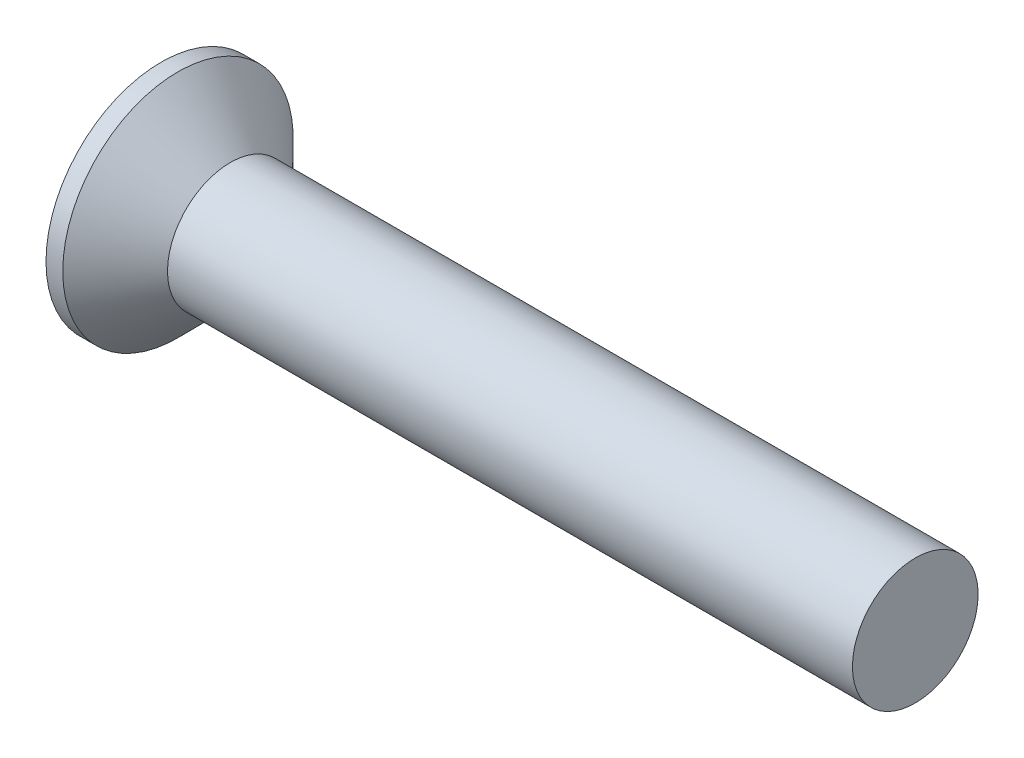
ISO-10303-21;
HEADER;
FILE_DESCRIPTION(('STEP AP214'),'2;1');
FILE_NAME('part.step','',(''),(''),'','','');
FILE_SCHEMA(('AUTOMOTIVE_DESIGN { 1 0 10303 214 1 1 1 1 }'));
ENDSEC;
DATA;
#1=APPLICATION_CONTEXT('core data for automotive mechanical design processes');
#2=APPLICATION_PROTOCOL_DEFINITION('international standard','automotive_design',2000,#1);
#3=PRODUCT_CONTEXT('',#1,'mechanical');
#4=PRODUCT('Part','Part','',(#3));
#5=PRODUCT_RELATED_PRODUCT_CATEGORY('part','',(#4));
#6=PRODUCT_DEFINITION_FORMATION('','',#4);
#7=PRODUCT_DEFINITION_CONTEXT('part definition',#1,'design');
#8=PRODUCT_DEFINITION('design','',#6,#7);
#9=PRODUCT_DEFINITION_SHAPE('','',#8);
#10=(LENGTH_UNIT() NAMED_UNIT(*) SI_UNIT(.MILLI.,.METRE.));
#11=(NAMED_UNIT(*) PLANE_ANGLE_UNIT() SI_UNIT($,.RADIAN.));
#12=(NAMED_UNIT(*) SI_UNIT($,.STERADIAN.) SOLID_ANGLE_UNIT());
#13=UNCERTAINTY_MEASURE_WITH_UNIT(LENGTH_MEASURE(1.E-05),#10,'distance_accuracy_value','');
#14=(GEOMETRIC_REPRESENTATION_CONTEXT(3) GLOBAL_UNCERTAINTY_ASSIGNED_CONTEXT((#13)) GLOBAL_UNIT_ASSIGNED_CONTEXT((#10,
#11,#12)) REPRESENTATION_CONTEXT('',''));
#15=CARTESIAN_POINT('',(0.,0.,0.));
#16=DIRECTION('',(0.,0.,1.));
#17=DIRECTION('',(1.,0.,0.));
#18=AXIS2_PLACEMENT_3D('',#15,#16,#17);
#19=CARTESIAN_POINT('',(0.,2.75,0.));
#20=DIRECTION('',(1.,0.,0.));
#21=DIRECTION('',(0.,0.,-1.));
#22=AXIS2_PLACEMENT_3D('',#19,#20,#21);
#23=PLANE('',#22);
#24=CARTESIAN_POINT('',(0.,0.,0.));
#25=DIRECTION('',(-1.,0.,0.));
#26=DIRECTION('',(0.,0.,1.));
#27=AXIS2_PLACEMENT_3D('',#24,#25,#26);
#28=CIRCLE('',#27,2.75);
#29=CARTESIAN_POINT('',(0.,0.,2.75));
#30=VERTEX_POINT('',#29);
#31=EDGE_CURVE('E45',#30,#30,#28,.T.);
#32=ORIENTED_EDGE('',*,*,#31,.T.);
#33=EDGE_LOOP('',(#32));
#34=FACE_BOUND('',#33,.T.);
#35=ADVANCED_FACE('F31',(#34),#23,.F.);
#36=CARTESIAN_POINT('',(18.,0.,0.));
#37=DIRECTION('',(-1.,0.,0.));
#38=DIRECTION('',(0.,0.,1.));
#39=AXIS2_PLACEMENT_3D('',#36,#37,#38);
#40=PLANE('',#39);
#41=CARTESIAN_POINT('',(18.,0.,0.));
#42=DIRECTION('',(-1.,0.,0.));
#43=DIRECTION('',(0.,0.,1.));
#44=AXIS2_PLACEMENT_3D('',#41,#42,#43);
#45=CIRCLE('',#44,1.5);
#46=CARTESIAN_POINT('',(18.,0.,1.5));
#47=VERTEX_POINT('',#46);
#48=EDGE_CURVE('E10',#47,#47,#45,.T.);
#49=ORIENTED_EDGE('',*,*,#48,.F.);
#50=EDGE_LOOP('',(#49));
#51=FACE_BOUND('',#50,.T.);
#52=ADVANCED_FACE('F65',(#51),#40,.F.);
#53=CARTESIAN_POINT('',(0.,0.,0.));
#54=DIRECTION('',(-1.,0.,0.));
#55=DIRECTION('',(0.,0.,1.));
#56=AXIS2_PLACEMENT_3D('',#53,#54,#55);
#57=CYLINDRICAL_SURFACE('',#56,1.5);
#58=CARTESIAN_POINT('',(1.65,0.,0.));
#59=DIRECTION('',(-1.,0.,0.));
#60=DIRECTION('',(0.,0.,1.));
#61=AXIS2_PLACEMENT_3D('',#58,#59,#60);
#62=CIRCLE('',#61,1.5);
#63=CARTESIAN_POINT('',(1.65,0.,1.5));
#64=VERTEX_POINT('',#63);
#65=EDGE_CURVE('E37',#64,#64,#62,.T.);
#66=ORIENTED_EDGE('',*,*,#65,.F.);
#67=EDGE_LOOP('',(#66));
#68=FACE_BOUND('',#67,.T.);
#69=ORIENTED_EDGE('',*,*,#48,.T.);
#70=EDGE_LOOP('',(#69));
#71=FACE_BOUND('',#70,.T.);
#72=ADVANCED_FACE('F60',(#68,#71),#57,.T.);
#73=CARTESIAN_POINT('',(1.65,0.,0.));
#74=DIRECTION('',(-1.,0.,0.));
#75=DIRECTION('',(0.,0.,1.));
#76=AXIS2_PLACEMENT_3D('',#73,#74,#75);
#77=CONICAL_SURFACE('',#76,1.5,0.78539816339745);
#78=CARTESIAN_POINT('',(0.400000000000003,0.,0.));
#79=DIRECTION('',(-1.,0.,0.));
#80=DIRECTION('',(0.,0.,1.));
#81=AXIS2_PLACEMENT_3D('',#78,#79,#80);
#82=CIRCLE('',#81,2.75);
#83=CARTESIAN_POINT('',(0.400000000000003,0.,2.75));
#84=VERTEX_POINT('',#83);
#85=EDGE_CURVE('E41',#84,#84,#82,.T.);
#86=ORIENTED_EDGE('',*,*,#85,.F.);
#87=EDGE_LOOP('',(#86));
#88=FACE_BOUND('',#87,.T.);
#89=ORIENTED_EDGE('',*,*,#65,.T.);
#90=EDGE_LOOP('',(#89));
#91=FACE_BOUND('',#90,.T.);
#92=ADVANCED_FACE('F55',(#88,#91),#77,.T.);
#93=CARTESIAN_POINT('',(0.,0.,0.));
#94=DIRECTION('',(-1.,0.,0.));
#95=DIRECTION('',(0.,0.,1.));
#96=AXIS2_PLACEMENT_3D('',#93,#94,#95);
#97=CYLINDRICAL_SURFACE('',#96,2.75);
#98=ORIENTED_EDGE('',*,*,#31,.F.);
#99=EDGE_LOOP('',(#98));
#100=FACE_BOUND('',#99,.T.);
#101=ORIENTED_EDGE('',*,*,#85,.T.);
#102=EDGE_LOOP('',(#101));
#103=FACE_BOUND('',#102,.T.);
#104=ADVANCED_FACE('F52',(#100,#103),#97,.T.);
#105=CLOSED_SHELL('',(#35,#52,#72,#92,#104));
#106=MANIFOLD_SOLID_BREP('B2',#105);
#107=ADVANCED_BREP_SHAPE_REPRESENTATION('',(#18,#106),#14);
#108=SHAPE_DEFINITION_REPRESENTATION(#9,#107);
ENDSEC;
END-ISO-10303-21;
